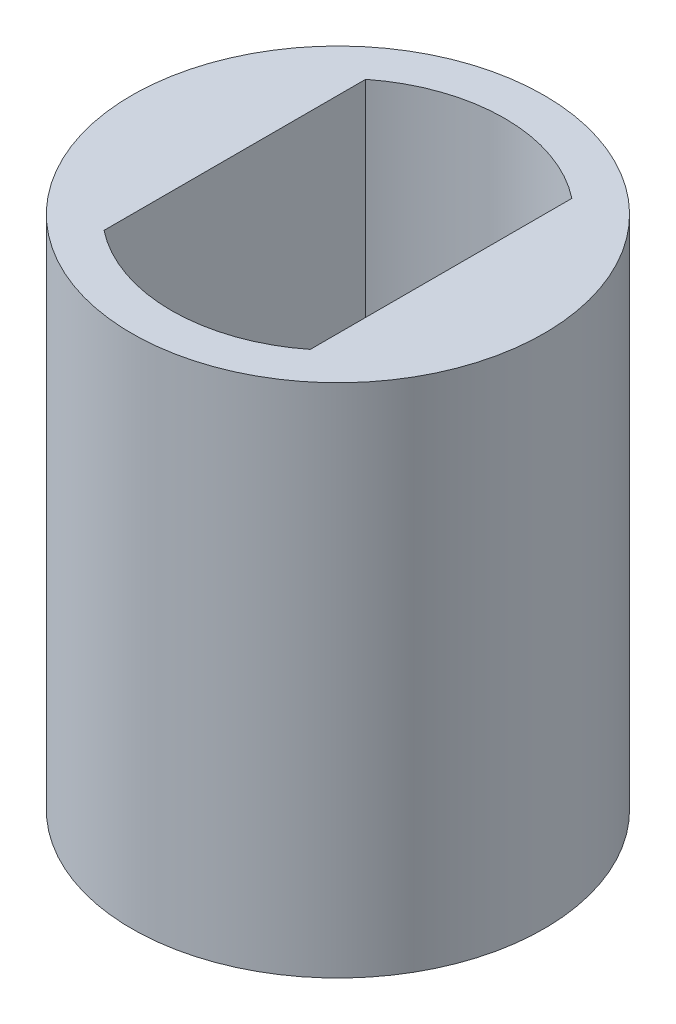
ISO-10303-21;
HEADER;
FILE_DESCRIPTION(('STEP AP214'),'2;1');
FILE_NAME('part.step','',(''),(''),'','','');
FILE_SCHEMA(('AUTOMOTIVE_DESIGN { 1 0 10303 214 1 1 1 1 }'));
ENDSEC;
DATA;
#1=APPLICATION_CONTEXT('core data for automotive mechanical design processes');
#2=APPLICATION_PROTOCOL_DEFINITION('international standard','automotive_design',2000,#1);
#3=PRODUCT_CONTEXT('',#1,'mechanical');
#4=PRODUCT('Part','Part','',(#3));
#5=PRODUCT_RELATED_PRODUCT_CATEGORY('part','',(#4));
#6=PRODUCT_DEFINITION_FORMATION('','',#4);
#7=PRODUCT_DEFINITION_CONTEXT('part definition',#1,'design');
#8=PRODUCT_DEFINITION('design','',#6,#7);
#9=PRODUCT_DEFINITION_SHAPE('','',#8);
#10=(LENGTH_UNIT() NAMED_UNIT(*) SI_UNIT(.MILLI.,.METRE.));
#11=(NAMED_UNIT(*) PLANE_ANGLE_UNIT() SI_UNIT($,.RADIAN.));
#12=(NAMED_UNIT(*) SI_UNIT($,.STERADIAN.) SOLID_ANGLE_UNIT());
#13=UNCERTAINTY_MEASURE_WITH_UNIT(LENGTH_MEASURE(1.E-05),#10,'distance_accuracy_value','');
#14=(GEOMETRIC_REPRESENTATION_CONTEXT(3) GLOBAL_UNCERTAINTY_ASSIGNED_CONTEXT((#13)) GLOBAL_UNIT_ASSIGNED_CONTEXT((#10,
#11,#12)) REPRESENTATION_CONTEXT('',''));
#15=CARTESIAN_POINT('',(0.,0.,0.));
#16=DIRECTION('',(0.,0.,1.));
#17=DIRECTION('',(1.,0.,0.));
#18=AXIS2_PLACEMENT_3D('',#15,#16,#17);
#19=CARTESIAN_POINT('',(0.,6.5,0.));
#20=DIRECTION('',(0.,-1.,0.));
#21=DIRECTION('',(0.,0.,-1.));
#22=AXIS2_PLACEMENT_3D('',#19,#20,#21);
#23=CYLINDRICAL_SURFACE('',#22,2.1);
#24=CARTESIAN_POINT('',(0.,0.,0.));
#25=DIRECTION('',(0.,1.,0.));
#26=DIRECTION('',(0.,0.,1.));
#27=AXIS2_PLACEMENT_3D('',#24,#25,#26);
#28=CIRCLE('',#27,2.1);
#29=CARTESIAN_POINT('',(1.3,0.,-1.64924225024706));
#30=VERTEX_POINT('',#29);
#31=CARTESIAN_POINT('',(-1.3,0.,-1.64924225024707));
#32=VERTEX_POINT('',#31);
#33=EDGE_CURVE('E102',#30,#32,#28,.T.);
#34=ORIENTED_EDGE('',*,*,#33,.F.);
#35=DIRECTION('',(0.,-1.,0.));
#36=VECTOR('',#35,1.);
#37=CARTESIAN_POINT('',(1.3,6.5,-1.64924225024706));
#38=LINE('',#37,#36);
#39=CARTESIAN_POINT('',(1.3,6.5,-1.64924225024706));
#40=VERTEX_POINT('',#39);
#41=EDGE_CURVE('E11',#40,#30,#38,.T.);
#42=ORIENTED_EDGE('',*,*,#41,.F.);
#43=CARTESIAN_POINT('',(0.,6.5,0.));
#44=DIRECTION('',(0.,1.,0.));
#45=DIRECTION('',(0.,0.,1.));
#46=AXIS2_PLACEMENT_3D('',#43,#44,#45);
#47=CIRCLE('',#46,2.1);
#48=CARTESIAN_POINT('',(-1.3,6.5,-1.64924225024707));
#49=VERTEX_POINT('',#48);
#50=EDGE_CURVE('E84',#40,#49,#47,.T.);
#51=ORIENTED_EDGE('',*,*,#50,.T.);
#52=DIRECTION('',(0.,-1.,0.));
#53=VECTOR('',#52,1.);
#54=CARTESIAN_POINT('',(-1.3,6.5,-1.64924225024707));
#55=LINE('',#54,#53);
#56=EDGE_CURVE('E51',#49,#32,#55,.T.);
#57=ORIENTED_EDGE('',*,*,#56,.T.);
#58=EDGE_LOOP('',(#34,#42,#51,#57));
#59=FACE_BOUND('',#58,.T.);
#60=ADVANCED_FACE('F35',(#59),#23,.F.);
#61=CARTESIAN_POINT('',(1.3,6.5,0.));
#62=DIRECTION('',(1.,0.,0.));
#63=DIRECTION('',(0.,0.,-1.));
#64=AXIS2_PLACEMENT_3D('',#61,#62,#63);
#65=PLANE('',#64);
#66=DIRECTION('',(0.,0.,1.));
#67=VECTOR('',#66,1.);
#68=CARTESIAN_POINT('',(1.3,0.,0.));
#69=LINE('',#68,#67);
#70=CARTESIAN_POINT('',(1.3,0.,1.64924225024706));
#71=VERTEX_POINT('',#70);
#72=EDGE_CURVE('E90',#30,#71,#69,.T.);
#73=ORIENTED_EDGE('',*,*,#72,.T.);
#74=DIRECTION('',(0.,-1.,0.));
#75=VECTOR('',#74,1.);
#76=CARTESIAN_POINT('',(1.3,6.5,1.64924225024706));
#77=LINE('',#76,#75);
#78=CARTESIAN_POINT('',(1.3,6.5,1.64924225024706));
#79=VERTEX_POINT('',#78);
#80=EDGE_CURVE('E43',#79,#71,#77,.T.);
#81=ORIENTED_EDGE('',*,*,#80,.F.);
#82=DIRECTION('',(0.,0.,1.));
#83=VECTOR('',#82,1.);
#84=CARTESIAN_POINT('',(1.3,6.5,0.));
#85=LINE('',#84,#83);
#86=EDGE_CURVE('E77',#40,#79,#85,.T.);
#87=ORIENTED_EDGE('',*,*,#86,.F.);
#88=ORIENTED_EDGE('',*,*,#41,.T.);
#89=EDGE_LOOP('',(#73,#81,#87,#88));
#90=FACE_BOUND('',#89,.T.);
#91=ADVANCED_FACE('F88',(#90),#65,.F.);
#92=CARTESIAN_POINT('',(0.,6.5,0.));
#93=DIRECTION('',(0.,-1.,0.));
#94=DIRECTION('',(0.,0.,-1.));
#95=AXIS2_PLACEMENT_3D('',#92,#93,#94);
#96=CYLINDRICAL_SURFACE('',#95,2.1);
#97=CARTESIAN_POINT('',(0.,0.,0.));
#98=DIRECTION('',(0.,1.,0.));
#99=DIRECTION('',(0.,0.,1.));
#100=AXIS2_PLACEMENT_3D('',#97,#98,#99);
#101=CIRCLE('',#100,2.1);
#102=CARTESIAN_POINT('',(-1.3,0.,1.64924225024707));
#103=VERTEX_POINT('',#102);
#104=EDGE_CURVE('E105',#103,#71,#101,.T.);
#105=ORIENTED_EDGE('',*,*,#104,.F.);
#106=DIRECTION('',(0.,-1.,0.));
#107=VECTOR('',#106,1.);
#108=CARTESIAN_POINT('',(-1.3,6.5,1.64924225024707));
#109=LINE('',#108,#107);
#110=CARTESIAN_POINT('',(-1.3,6.5,1.64924225024707));
#111=VERTEX_POINT('',#110);
#112=EDGE_CURVE('E64',#111,#103,#109,.T.);
#113=ORIENTED_EDGE('',*,*,#112,.F.);
#114=CARTESIAN_POINT('',(0.,6.5,0.));
#115=DIRECTION('',(0.,1.,0.));
#116=DIRECTION('',(0.,0.,1.));
#117=AXIS2_PLACEMENT_3D('',#114,#115,#116);
#118=CIRCLE('',#117,2.1);
#119=EDGE_CURVE('E83',#111,#79,#118,.T.);
#120=ORIENTED_EDGE('',*,*,#119,.T.);
#121=ORIENTED_EDGE('',*,*,#80,.T.);
#122=EDGE_LOOP('',(#105,#113,#120,#121));
#123=FACE_BOUND('',#122,.T.);
#124=ADVANCED_FACE('F93',(#123),#96,.F.);
#125=CARTESIAN_POINT('',(-1.3,6.5,0.));
#126=DIRECTION('',(1.,0.,0.));
#127=DIRECTION('',(0.,0.,-1.));
#128=AXIS2_PLACEMENT_3D('',#125,#126,#127);
#129=PLANE('',#128);
#130=DIRECTION('',(0.,0.,1.));
#131=VECTOR('',#130,1.);
#132=CARTESIAN_POINT('',(-1.3,0.,0.));
#133=LINE('',#132,#131);
#134=EDGE_CURVE('E107',#32,#103,#133,.T.);
#135=ORIENTED_EDGE('',*,*,#134,.F.);
#136=ORIENTED_EDGE('',*,*,#56,.F.);
#137=DIRECTION('',(0.,0.,1.));
#138=VECTOR('',#137,1.);
#139=CARTESIAN_POINT('',(-1.3,6.5,0.));
#140=LINE('',#139,#138);
#141=EDGE_CURVE('E94',#49,#111,#140,.T.);
#142=ORIENTED_EDGE('',*,*,#141,.T.);
#143=ORIENTED_EDGE('',*,*,#112,.T.);
#144=EDGE_LOOP('',(#135,#136,#142,#143));
#145=FACE_BOUND('',#144,.T.);
#146=ADVANCED_FACE('F116',(#145),#129,.T.);
#147=CARTESIAN_POINT('',(0.,6.5,0.));
#148=DIRECTION('',(0.,-1.,0.));
#149=DIRECTION('',(0.,0.,-1.));
#150=AXIS2_PLACEMENT_3D('',#147,#148,#149);
#151=CYLINDRICAL_SURFACE('',#150,2.6);
#152=CARTESIAN_POINT('',(0.,6.5,0.));
#153=DIRECTION('',(0.,1.,0.));
#154=DIRECTION('',(0.,0.,1.));
#155=AXIS2_PLACEMENT_3D('',#152,#153,#154);
#156=CIRCLE('',#155,2.6);
#157=CARTESIAN_POINT('',(0.,6.5,-2.6));
#158=VERTEX_POINT('',#157);
#159=EDGE_CURVE('E96',#158,#158,#156,.T.);
#160=CARTESIAN_POINT('',(0.,0.,0.));
#161=DIRECTION('',(0.,1.,0.));
#162=DIRECTION('',(0.,0.,1.));
#163=AXIS2_PLACEMENT_3D('',#160,#161,#162);
#164=CIRCLE('',#163,2.6);
#165=CARTESIAN_POINT('',(0.,0.,-2.6));
#166=VERTEX_POINT('',#165);
#167=EDGE_CURVE('E110',#166,#166,#164,.T.);
#168=CARTESIAN_POINT('',(0.,6.5,-2.6));
#169=CARTESIAN_POINT('',(0.,6.43229166666667,-2.6));
#170=CARTESIAN_POINT('',(0.,6.36458333333333,-2.6));
#171=CARTESIAN_POINT('',(0.,6.22916666666667,-2.6));
#172=CARTESIAN_POINT('',(0.,6.16145833333333,-2.6));
#173=CARTESIAN_POINT('',(0.,6.02604166666667,-2.6));
#174=CARTESIAN_POINT('',(0.,5.95833333333333,-2.6));
#175=CARTESIAN_POINT('',(0.,5.82291666666667,-2.6));
#176=CARTESIAN_POINT('',(0.,5.75520833333333,-2.6));
#177=CARTESIAN_POINT('',(0.,5.61979166666667,-2.6));
#178=CARTESIAN_POINT('',(0.,5.55208333333333,-2.6));
#179=CARTESIAN_POINT('',(0.,5.41666666666667,-2.6));
#180=CARTESIAN_POINT('',(0.,5.34895833333333,-2.6));
#181=CARTESIAN_POINT('',(0.,5.21354166666667,-2.6));
#182=CARTESIAN_POINT('',(0.,5.14583333333333,-2.6));
#183=CARTESIAN_POINT('',(0.,5.01041666666667,-2.6));
#184=CARTESIAN_POINT('',(0.,4.94270833333333,-2.6));
#185=CARTESIAN_POINT('',(0.,4.80729166666667,-2.6));
#186=CARTESIAN_POINT('',(0.,4.73958333333333,-2.6));
#187=CARTESIAN_POINT('',(0.,4.60416666666667,-2.6));
#188=CARTESIAN_POINT('',(0.,4.53645833333333,-2.6));
#189=CARTESIAN_POINT('',(0.,4.40104166666667,-2.6));
#190=CARTESIAN_POINT('',(0.,4.33333333333333,-2.6));
#191=CARTESIAN_POINT('',(0.,4.19791666666667,-2.6));
#192=CARTESIAN_POINT('',(0.,4.13020833333333,-2.6));
#193=CARTESIAN_POINT('',(0.,3.99479166666667,-2.6));
#194=CARTESIAN_POINT('',(0.,3.92708333333333,-2.6));
#195=CARTESIAN_POINT('',(0.,3.79166666666667,-2.6));
#196=CARTESIAN_POINT('',(0.,3.72395833333333,-2.6));
#197=CARTESIAN_POINT('',(0.,3.58854166666667,-2.6));
#198=CARTESIAN_POINT('',(0.,3.52083333333333,-2.6));
#199=CARTESIAN_POINT('',(0.,3.38541666666667,-2.6));
#200=CARTESIAN_POINT('',(0.,3.31770833333333,-2.6));
#201=CARTESIAN_POINT('',(0.,3.18229166666667,-2.6));
#202=CARTESIAN_POINT('',(0.,3.11458333333333,-2.6));
#203=CARTESIAN_POINT('',(0.,2.97916666666667,-2.6));
#204=CARTESIAN_POINT('',(0.,2.91145833333333,-2.6));
#205=CARTESIAN_POINT('',(0.,2.77604166666667,-2.6));
#206=CARTESIAN_POINT('',(0.,2.70833333333333,-2.6));
#207=CARTESIAN_POINT('',(0.,2.57291666666667,-2.6));
#208=CARTESIAN_POINT('',(0.,2.50520833333333,-2.6));
#209=CARTESIAN_POINT('',(0.,2.36979166666667,-2.6));
#210=CARTESIAN_POINT('',(0.,2.30208333333333,-2.6));
#211=CARTESIAN_POINT('',(0.,2.16666666666667,-2.6));
#212=CARTESIAN_POINT('',(0.,2.09895833333333,-2.6));
#213=CARTESIAN_POINT('',(0.,1.96354166666667,-2.6));
#214=CARTESIAN_POINT('',(0.,1.89583333333333,-2.6));
#215=CARTESIAN_POINT('',(0.,1.76041666666667,-2.6));
#216=CARTESIAN_POINT('',(0.,1.69270833333333,-2.6));
#217=CARTESIAN_POINT('',(0.,1.55729166666667,-2.6));
#218=CARTESIAN_POINT('',(0.,1.48958333333333,-2.6));
#219=CARTESIAN_POINT('',(0.,1.35416666666667,-2.6));
#220=CARTESIAN_POINT('',(0.,1.28645833333333,-2.6));
#221=CARTESIAN_POINT('',(0.,1.15104166666667,-2.6));
#222=CARTESIAN_POINT('',(0.,1.08333333333333,-2.6));
#223=CARTESIAN_POINT('',(0.,0.947916666666667,-2.6));
#224=CARTESIAN_POINT('',(0.,0.880208333333333,-2.6));
#225=CARTESIAN_POINT('',(0.,0.744791666666667,-2.6));
#226=CARTESIAN_POINT('',(0.,0.677083333333333,-2.6));
#227=CARTESIAN_POINT('',(0.,0.541666666666667,-2.6));
#228=CARTESIAN_POINT('',(0.,0.473958333333333,-2.6));
#229=CARTESIAN_POINT('',(0.,0.338541666666667,-2.6));
#230=CARTESIAN_POINT('',(0.,0.270833333333334,-2.6));
#231=CARTESIAN_POINT('',(0.,0.135416666666667,-2.6));
#232=CARTESIAN_POINT('',(0.,0.0677083333333334,-2.6));
#233=CARTESIAN_POINT('',(0.,0.,-2.6));
#234=B_SPLINE_CURVE_WITH_KNOTS('',3,(#168,#169,#170,#171,#172,#173,#174,#175,#176,#177,#178,
#179,#180,#181,#182,#183,#184,#185,#186,#187,#188,#189,#190,#191,#192,#193,#194,#195,#196,#197,
#198,#199,#200,#201,#202,#203,#204,#205,#206,#207,#208,#209,#210,#211,#212,#213,#214,#215,#216,
#217,#218,#219,#220,#221,#222,#223,#224,#225,#226,#227,#228,#229,#230,#231,#232,#233),
.UNSPECIFIED.,.F.,.F.,(4,2,2,2,2,2,2,2,2,2,2,2,2,2,2,2,2,2,2,2,2,2,2,2,2,2,2,2,2,2,2,2,4),(0.,
0.203124999999999,0.40625,0.609375,0.812499999999999,1.015625,1.21875,1.421875,1.625,1.828125,
2.03125,2.234375,2.4375,2.640625,2.84375,3.046875,3.25,3.453125,3.65625,3.859375,4.0625,
4.265625,4.46875,4.671875,4.875,5.078125,5.28125,5.484375,5.6875,5.890625,6.09375,6.296875,6.5),.UNSPECIFIED.);
#235=EDGE_CURVE('BSEAM118',#158,#166,#234,.T.);
#236=ORIENTED_EDGE('',*,*,#159,.F.);
#237=ORIENTED_EDGE('',*,*,#167,.T.);
#238=ORIENTED_EDGE('',*,*,#235,.T.);
#239=ORIENTED_EDGE('',*,*,#235,.F.);
#240=EDGE_LOOP('',(#236,#238,#237,#239));
#241=FACE_BOUND('',#240,.T.);
#242=ADVANCED_FACE('F118',(#241),#151,.T.);
#243=CARTESIAN_POINT('',(0.,6.5,0.));
#244=DIRECTION('',(0.,1.,0.));
#245=DIRECTION('',(0.,0.,1.));
#246=AXIS2_PLACEMENT_3D('',#243,#244,#245);
#247=PLANE('',#246);
#248=ORIENTED_EDGE('',*,*,#50,.F.);
#249=ORIENTED_EDGE('',*,*,#86,.T.);
#250=ORIENTED_EDGE('',*,*,#119,.F.);
#251=ORIENTED_EDGE('',*,*,#141,.F.);
#252=EDGE_LOOP('',(#248,#249,#250,#251));
#253=FACE_BOUND('',#252,.T.);
#254=ORIENTED_EDGE('',*,*,#159,.T.);
#255=EDGE_LOOP('',(#254));
#256=FACE_BOUND('',#255,.T.);
#257=ADVANCED_FACE('F79',(#253,#256),#247,.T.);
#258=CARTESIAN_POINT('',(0.,0.,0.));
#259=DIRECTION('',(0.,1.,0.));
#260=DIRECTION('',(0.,0.,1.));
#261=AXIS2_PLACEMENT_3D('',#258,#259,#260);
#262=PLANE('',#261);
#263=ORIENTED_EDGE('',*,*,#33,.T.);
#264=ORIENTED_EDGE('',*,*,#134,.T.);
#265=ORIENTED_EDGE('',*,*,#104,.T.);
#266=ORIENTED_EDGE('',*,*,#72,.F.);
#267=EDGE_LOOP('',(#263,#264,#265,#266));
#268=FACE_BOUND('',#267,.T.);
#269=ORIENTED_EDGE('',*,*,#167,.F.);
#270=EDGE_LOOP('',(#269));
#271=FACE_BOUND('',#270,.T.);
#272=ADVANCED_FACE('F157',(#268,#271),#262,.F.);
#273=CLOSED_SHELL('',(#60,#91,#124,#146,#242,#257,#272));
#274=MANIFOLD_SOLID_BREP('B2',#273);
#275=ADVANCED_BREP_SHAPE_REPRESENTATION('',(#18,#274),#14);
#276=SHAPE_DEFINITION_REPRESENTATION(#9,#275);
ENDSEC;
END-ISO-10303-21;
